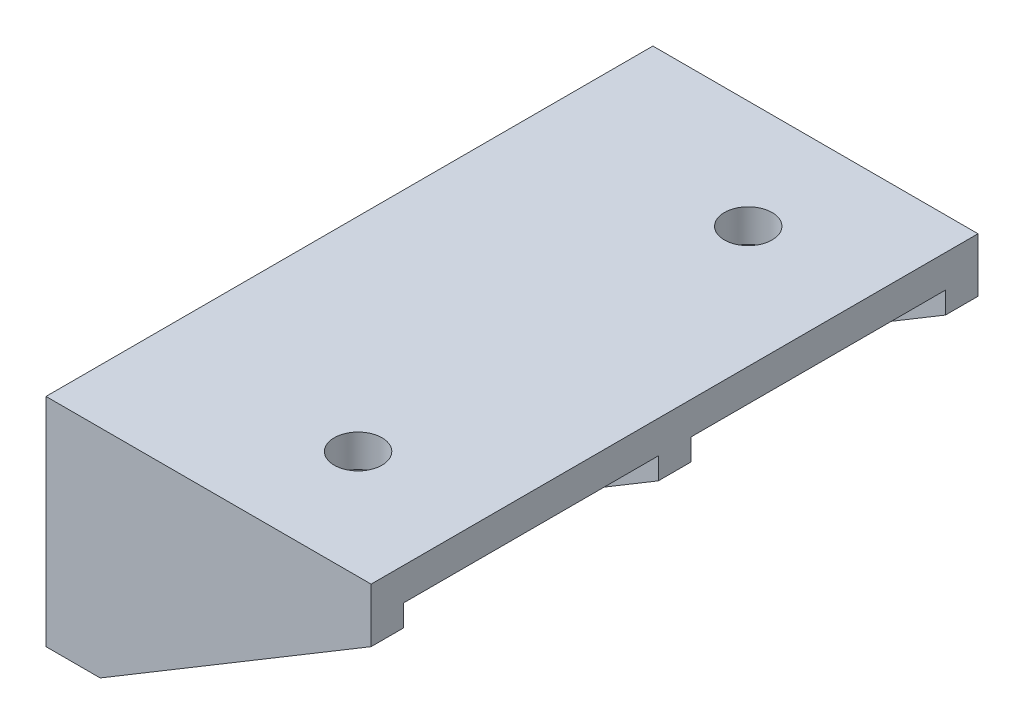
ISO-10303-21;
HEADER;
FILE_DESCRIPTION(('STEP AP214'),'2;1');
FILE_NAME('part.step','',(''),(''),'','','');
FILE_SCHEMA(('AUTOMOTIVE_DESIGN { 1 0 10303 214 1 1 1 1 }'));
ENDSEC;
DATA;
#1=APPLICATION_CONTEXT('core data for automotive mechanical design processes');
#2=APPLICATION_PROTOCOL_DEFINITION('international standard','automotive_design',2000,#1);
#3=PRODUCT_CONTEXT('',#1,'mechanical');
#4=PRODUCT('Part','Part','',(#3));
#5=PRODUCT_RELATED_PRODUCT_CATEGORY('part','',(#4));
#6=PRODUCT_DEFINITION_FORMATION('','',#4);
#7=PRODUCT_DEFINITION_CONTEXT('part definition',#1,'design');
#8=PRODUCT_DEFINITION('design','',#6,#7);
#9=PRODUCT_DEFINITION_SHAPE('','',#8);
#10=(LENGTH_UNIT() NAMED_UNIT(*) SI_UNIT(.MILLI.,.METRE.));
#11=(NAMED_UNIT(*) PLANE_ANGLE_UNIT() SI_UNIT($,.RADIAN.));
#12=(NAMED_UNIT(*) SI_UNIT($,.STERADIAN.) SOLID_ANGLE_UNIT());
#13=UNCERTAINTY_MEASURE_WITH_UNIT(LENGTH_MEASURE(1.E-05),#10,'distance_accuracy_value','');
#14=(GEOMETRIC_REPRESENTATION_CONTEXT(3) GLOBAL_UNCERTAINTY_ASSIGNED_CONTEXT((#13)) GLOBAL_UNIT_ASSIGNED_CONTEXT((#10,
#11,#12)) REPRESENTATION_CONTEXT('',''));
#15=CARTESIAN_POINT('',(0.,0.,0.));
#16=DIRECTION('',(0.,0.,1.));
#17=DIRECTION('',(1.,0.,0.));
#18=AXIS2_PLACEMENT_3D('',#15,#16,#17);
#19=CARTESIAN_POINT('',(3.,17.,28.));
#20=DIRECTION('',(-1.,0.,0.));
#21=DIRECTION('',(0.,-1.,0.));
#22=AXIS2_PLACEMENT_3D('',#19,#20,#21);
#23=PLANE('',#22);
#24=CARTESIAN_POINT('',(3.,10.,-18.));
#25=DIRECTION('',(-1.,0.,0.));
#26=DIRECTION('',(0.,-1.,0.));
#27=AXIS2_PLACEMENT_3D('',#24,#25,#26);
#28=CIRCLE('',#27,1.7);
#29=CARTESIAN_POINT('',(3.,10.,-16.3));
#30=VERTEX_POINT('',#29);
#31=EDGE_CURVE('E346',#30,#30,#28,.T.);
#32=ORIENTED_EDGE('',*,*,#31,.T.);
#33=EDGE_LOOP('',(#32));
#34=FACE_BOUND('',#33,.T.);
#35=DIRECTION('',(0.,1.,0.));
#36=VECTOR('',#35,1.);
#37=CARTESIAN_POINT('',(3.,0.,-25.));
#38=LINE('',#37,#36);
#39=CARTESIAN_POINT('',(3.,0.,-25.));
#40=VERTEX_POINT('',#39);
#41=CARTESIAN_POINT('',(3.,17.,-25.));
#42=VERTEX_POINT('',#41);
#43=EDGE_CURVE('E50',#40,#42,#38,.T.);
#44=ORIENTED_EDGE('',*,*,#43,.T.);
#45=DIRECTION('',(0.,0.,-1.));
#46=VECTOR('',#45,1.);
#47=CARTESIAN_POINT('',(3.,17.,28.));
#48=LINE('',#47,#46);
#49=CARTESIAN_POINT('',(3.,17.,-1.5));
#50=VERTEX_POINT('',#49);
#51=EDGE_CURVE('E256',#50,#42,#48,.T.);
#52=ORIENTED_EDGE('',*,*,#51,.F.);
#53=DIRECTION('',(0.,-1.,0.));
#54=VECTOR('',#53,1.);
#55=CARTESIAN_POINT('',(3.,17.,-1.5));
#56=LINE('',#55,#54);
#57=CARTESIAN_POINT('',(3.,0.,-1.5));
#58=VERTEX_POINT('',#57);
#59=EDGE_CURVE('E176',#50,#58,#56,.T.);
#60=ORIENTED_EDGE('',*,*,#59,.T.);
#61=DIRECTION('',(0.,0.,-1.));
#62=VECTOR('',#61,1.);
#63=CARTESIAN_POINT('',(3.,0.,28.));
#64=LINE('',#63,#62);
#65=EDGE_CURVE('E43',#58,#40,#64,.T.);
#66=ORIENTED_EDGE('',*,*,#65,.T.);
#67=EDGE_LOOP('',(#44,#52,#60,#66));
#68=FACE_BOUND('',#67,.T.);
#69=ADVANCED_FACE('F35',(#34,#68),#23,.F.);
#70=CARTESIAN_POINT('',(30.,17.,28.));
#71=DIRECTION('',(0.,1.,0.));
#72=DIRECTION('',(-1.,0.,0.));
#73=AXIS2_PLACEMENT_3D('',#70,#71,#72);
#74=PLANE('',#73);
#75=CARTESIAN_POINT('',(18.8,17.,-18.));
#76=DIRECTION('',(0.,1.,0.));
#77=DIRECTION('',(-1.,0.,0.));
#78=AXIS2_PLACEMENT_3D('',#75,#76,#77);
#79=CIRCLE('',#78,2.2);
#80=CARTESIAN_POINT('',(16.6,17.,-18.));
#81=VERTEX_POINT('',#80);
#82=EDGE_CURVE('E166',#81,#81,#79,.T.);
#83=ORIENTED_EDGE('',*,*,#82,.T.);
#84=EDGE_LOOP('',(#83));
#85=FACE_BOUND('',#84,.T.);
#86=DIRECTION('',(1.,0.,0.));
#87=VECTOR('',#86,1.);
#88=CARTESIAN_POINT('',(0.,17.,-25.));
#89=LINE('',#88,#87);
#90=CARTESIAN_POINT('',(30.,17.,-25.));
#91=VERTEX_POINT('',#90);
#92=EDGE_CURVE('E173',#42,#91,#89,.T.);
#93=ORIENTED_EDGE('',*,*,#92,.T.);
#94=DIRECTION('',(0.,0.,-1.));
#95=VECTOR('',#94,1.);
#96=CARTESIAN_POINT('',(30.,17.,28.));
#97=LINE('',#96,#95);
#98=CARTESIAN_POINT('',(30.,17.,-1.5));
#99=VERTEX_POINT('',#98);
#100=EDGE_CURVE('E253',#99,#91,#97,.T.);
#101=ORIENTED_EDGE('',*,*,#100,.F.);
#102=DIRECTION('',(-1.,0.,0.));
#103=VECTOR('',#102,1.);
#104=CARTESIAN_POINT('',(30.,17.,-1.5));
#105=LINE('',#104,#103);
#106=EDGE_CURVE('E182',#99,#50,#105,.T.);
#107=ORIENTED_EDGE('',*,*,#106,.T.);
#108=ORIENTED_EDGE('',*,*,#51,.T.);
#109=EDGE_LOOP('',(#93,#101,#107,#108));
#110=FACE_BOUND('',#109,.T.);
#111=ADVANCED_FACE('F263',(#85,#110),#74,.F.);
#112=CARTESIAN_POINT('',(3.,10.,18.));
#113=DIRECTION('',(-1.,0.,0.));
#114=DIRECTION('',(0.,-1.,0.));
#115=AXIS2_PLACEMENT_3D('',#112,#113,#114);
#116=CIRCLE('',#115,1.7);
#117=CARTESIAN_POINT('',(3.,10.,19.7));
#118=VERTEX_POINT('',#117);
#119=EDGE_CURVE('E337',#118,#118,#116,.T.);
#120=ORIENTED_EDGE('',*,*,#119,.T.);
#121=EDGE_LOOP('',(#120));
#122=FACE_BOUND('',#121,.T.);
#123=CARTESIAN_POINT('',(3.,0.,25.));
#124=VERTEX_POINT('',#123);
#125=CARTESIAN_POINT('',(3.,0.,1.5));
#126=VERTEX_POINT('',#125);
#127=EDGE_CURVE('E11',#124,#126,#64,.T.);
#128=ORIENTED_EDGE('',*,*,#127,.T.);
#129=DIRECTION('',(0.,-1.,0.));
#130=VECTOR('',#129,1.);
#131=CARTESIAN_POINT('',(3.,17.,1.5));
#132=LINE('',#131,#130);
#133=CARTESIAN_POINT('',(3.,17.,1.5));
#134=VERTEX_POINT('',#133);
#135=EDGE_CURVE('E178',#134,#126,#132,.T.);
#136=ORIENTED_EDGE('',*,*,#135,.F.);
#137=CARTESIAN_POINT('',(3.,17.,25.));
#138=VERTEX_POINT('',#137);
#139=EDGE_CURVE('E257',#138,#134,#48,.T.);
#140=ORIENTED_EDGE('',*,*,#139,.F.);
#141=DIRECTION('',(0.,-1.,0.));
#142=VECTOR('',#141,1.);
#143=CARTESIAN_POINT('',(3.,0.,25.));
#144=LINE('',#143,#142);
#145=EDGE_CURVE('E210',#138,#124,#144,.T.);
#146=ORIENTED_EDGE('',*,*,#145,.T.);
#147=EDGE_LOOP('',(#128,#136,#140,#146));
#148=FACE_BOUND('',#147,.T.);
#149=ADVANCED_FACE('F283',(#122,#148),#23,.F.);
#150=CARTESIAN_POINT('',(18.8,17.,18.));
#151=DIRECTION('',(0.,1.,0.));
#152=DIRECTION('',(-1.,0.,0.));
#153=AXIS2_PLACEMENT_3D('',#150,#151,#152);
#154=CIRCLE('',#153,2.2);
#155=CARTESIAN_POINT('',(16.6,17.,18.));
#156=VERTEX_POINT('',#155);
#157=EDGE_CURVE('E169',#156,#156,#154,.T.);
#158=ORIENTED_EDGE('',*,*,#157,.T.);
#159=EDGE_LOOP('',(#158));
#160=FACE_BOUND('',#159,.T.);
#161=ORIENTED_EDGE('',*,*,#139,.T.);
#162=DIRECTION('',(-1.,0.,0.));
#163=VECTOR('',#162,1.);
#164=CARTESIAN_POINT('',(30.,17.,1.5));
#165=LINE('',#164,#163);
#166=CARTESIAN_POINT('',(30.,17.,1.5));
#167=VERTEX_POINT('',#166);
#168=EDGE_CURVE('E188',#167,#134,#165,.T.);
#169=ORIENTED_EDGE('',*,*,#168,.F.);
#170=CARTESIAN_POINT('',(30.,17.,25.));
#171=VERTEX_POINT('',#170);
#172=EDGE_CURVE('E254',#171,#167,#97,.T.);
#173=ORIENTED_EDGE('',*,*,#172,.F.);
#174=DIRECTION('',(-1.,0.,0.));
#175=VECTOR('',#174,1.);
#176=CARTESIAN_POINT('',(0.,17.,25.));
#177=LINE('',#176,#175);
#178=EDGE_CURVE('E207',#171,#138,#177,.T.);
#179=ORIENTED_EDGE('',*,*,#178,.T.);
#180=EDGE_LOOP('',(#161,#169,#173,#179));
#181=FACE_BOUND('',#180,.T.);
#182=ADVANCED_FACE('F289',(#160,#181),#74,.F.);
#183=CARTESIAN_POINT('',(0.,0.,28.));
#184=DIRECTION('',(0.,1.,0.));
#185=DIRECTION('',(0.,0.,1.));
#186=AXIS2_PLACEMENT_3D('',#183,#184,#185);
#187=PLANE('',#186);
#188=DIRECTION('',(1.,0.,0.));
#189=VECTOR('',#188,1.);
#190=CARTESIAN_POINT('',(0.,0.,-28.));
#191=LINE('',#190,#189);
#192=CARTESIAN_POINT('',(0.,0.,-28.));
#193=VERTEX_POINT('',#192);
#194=CARTESIAN_POINT('',(5.,0.,-28.));
#195=VERTEX_POINT('',#194);
#196=EDGE_CURVE('E146',#193,#195,#191,.T.);
#197=ORIENTED_EDGE('',*,*,#196,.T.);
#198=DIRECTION('',(0.,0.,-1.));
#199=VECTOR('',#198,1.);
#200=CARTESIAN_POINT('',(5.,0.,-25.));
#201=LINE('',#200,#199);
#202=CARTESIAN_POINT('',(5.,0.,-25.));
#203=VERTEX_POINT('',#202);
#204=EDGE_CURVE('E141',#203,#195,#201,.T.);
#205=ORIENTED_EDGE('',*,*,#204,.F.);
#206=DIRECTION('',(-1.,0.,0.));
#207=VECTOR('',#206,1.);
#208=CARTESIAN_POINT('',(0.,0.,-25.));
#209=LINE('',#208,#207);
#210=EDGE_CURVE('E143',#203,#40,#209,.T.);
#211=ORIENTED_EDGE('',*,*,#210,.T.);
#212=ORIENTED_EDGE('',*,*,#65,.F.);
#213=DIRECTION('',(1.,0.,0.));
#214=VECTOR('',#213,1.);
#215=CARTESIAN_POINT('',(3.,0.,-1.5));
#216=LINE('',#215,#214);
#217=CARTESIAN_POINT('',(5.,0.,-1.5));
#218=VERTEX_POINT('',#217);
#219=EDGE_CURVE('E192',#58,#218,#216,.T.);
#220=ORIENTED_EDGE('',*,*,#219,.T.);
#221=DIRECTION('',(0.,0.,-1.));
#222=VECTOR('',#221,1.);
#223=CARTESIAN_POINT('',(5.,0.,1.5));
#224=LINE('',#223,#222);
#225=CARTESIAN_POINT('',(5.,0.,1.5));
#226=VERTEX_POINT('',#225);
#227=EDGE_CURVE('E203',#226,#218,#224,.T.);
#228=ORIENTED_EDGE('',*,*,#227,.F.);
#229=DIRECTION('',(1.,0.,0.));
#230=VECTOR('',#229,1.);
#231=CARTESIAN_POINT('',(3.,0.,1.5));
#232=LINE('',#231,#230);
#233=EDGE_CURVE('E181',#126,#226,#232,.T.);
#234=ORIENTED_EDGE('',*,*,#233,.F.);
#235=ORIENTED_EDGE('',*,*,#127,.F.);
#236=DIRECTION('',(1.,0.,0.));
#237=VECTOR('',#236,1.);
#238=CARTESIAN_POINT('',(0.,0.,25.));
#239=LINE('',#238,#237);
#240=CARTESIAN_POINT('',(5.,0.,25.));
#241=VERTEX_POINT('',#240);
#242=EDGE_CURVE('E213',#124,#241,#239,.T.);
#243=ORIENTED_EDGE('',*,*,#242,.T.);
#244=DIRECTION('',(0.,0.,1.));
#245=VECTOR('',#244,1.);
#246=CARTESIAN_POINT('',(5.,0.,25.));
#247=LINE('',#246,#245);
#248=CARTESIAN_POINT('',(5.,0.,28.));
#249=VERTEX_POINT('',#248);
#250=EDGE_CURVE('E222',#241,#249,#247,.T.);
#251=ORIENTED_EDGE('',*,*,#250,.T.);
#252=DIRECTION('',(1.,0.,0.));
#253=VECTOR('',#252,1.);
#254=CARTESIAN_POINT('',(0.,0.,28.));
#255=LINE('',#254,#253);
#256=CARTESIAN_POINT('',(0.,0.,28.));
#257=VERTEX_POINT('',#256);
#258=EDGE_CURVE('E230',#257,#249,#255,.T.);
#259=ORIENTED_EDGE('',*,*,#258,.F.);
#260=DIRECTION('',(0.,0.,-1.));
#261=VECTOR('',#260,1.);
#262=CARTESIAN_POINT('',(0.,0.,28.));
#263=LINE('',#262,#261);
#264=EDGE_CURVE('E239',#257,#193,#263,.T.);
#265=ORIENTED_EDGE('',*,*,#264,.T.);
#266=EDGE_LOOP('',(#197,#205,#211,#212,#220,#228,#234,#235,#243,#251,#259,#265));
#267=FACE_BOUND('',#266,.T.);
#268=ADVANCED_FACE('F37',(#267),#187,.F.);
#269=CARTESIAN_POINT('',(30.,17.,28.));
#270=DIRECTION('',(-1.,0.,0.));
#271=DIRECTION('',(0.,0.,1.));
#272=AXIS2_PLACEMENT_3D('',#269,#270,#271);
#273=PLANE('',#272);
#274=DIRECTION('',(0.,1.,0.));
#275=VECTOR('',#274,1.);
#276=CARTESIAN_POINT('',(30.,17.,-28.));
#277=LINE('',#276,#275);
#278=CARTESIAN_POINT('',(30.,15.,-28.));
#279=VERTEX_POINT('',#278);
#280=CARTESIAN_POINT('',(30.,20.,-28.));
#281=VERTEX_POINT('',#280);
#282=EDGE_CURVE('E241',#279,#281,#277,.T.);
#283=ORIENTED_EDGE('',*,*,#282,.T.);
#284=DIRECTION('',(0.,0.,-1.));
#285=VECTOR('',#284,1.);
#286=CARTESIAN_POINT('',(30.,20.,28.));
#287=LINE('',#286,#285);
#288=CARTESIAN_POINT('',(30.,20.,28.));
#289=VERTEX_POINT('',#288);
#290=EDGE_CURVE('E250',#289,#281,#287,.T.);
#291=ORIENTED_EDGE('',*,*,#290,.F.);
#292=DIRECTION('',(0.,1.,0.));
#293=VECTOR('',#292,1.);
#294=CARTESIAN_POINT('',(30.,17.,28.));
#295=LINE('',#294,#293);
#296=CARTESIAN_POINT('',(30.,15.,28.));
#297=VERTEX_POINT('',#296);
#298=EDGE_CURVE('E232',#297,#289,#295,.T.);
#299=ORIENTED_EDGE('',*,*,#298,.F.);
#300=DIRECTION('',(0.,0.,1.));
#301=VECTOR('',#300,1.);
#302=CARTESIAN_POINT('',(30.,15.,25.));
#303=LINE('',#302,#301);
#304=CARTESIAN_POINT('',(30.,15.,25.));
#305=VERTEX_POINT('',#304);
#306=EDGE_CURVE('E225',#305,#297,#303,.T.);
#307=ORIENTED_EDGE('',*,*,#306,.F.);
#308=DIRECTION('',(0.,1.,0.));
#309=VECTOR('',#308,1.);
#310=CARTESIAN_POINT('',(30.,0.,25.));
#311=LINE('',#310,#309);
#312=EDGE_CURVE('E219',#305,#171,#311,.T.);
#313=ORIENTED_EDGE('',*,*,#312,.T.);
#314=ORIENTED_EDGE('',*,*,#172,.T.);
#315=DIRECTION('',(0.,1.,0.));
#316=VECTOR('',#315,1.);
#317=CARTESIAN_POINT('',(30.,15.,1.5));
#318=LINE('',#317,#316);
#319=CARTESIAN_POINT('',(30.,15.,1.5));
#320=VERTEX_POINT('',#319);
#321=EDGE_CURVE('E186',#320,#167,#318,.T.);
#322=ORIENTED_EDGE('',*,*,#321,.F.);
#323=DIRECTION('',(0.,0.,-1.));
#324=VECTOR('',#323,1.);
#325=CARTESIAN_POINT('',(30.,15.,1.5));
#326=LINE('',#325,#324);
#327=CARTESIAN_POINT('',(30.,15.,-1.5));
#328=VERTEX_POINT('',#327);
#329=EDGE_CURVE('E190',#320,#328,#326,.T.);
#330=ORIENTED_EDGE('',*,*,#329,.T.);
#331=DIRECTION('',(0.,1.,0.));
#332=VECTOR('',#331,1.);
#333=CARTESIAN_POINT('',(30.,15.,-1.5));
#334=LINE('',#333,#332);
#335=EDGE_CURVE('E196',#328,#99,#334,.T.);
#336=ORIENTED_EDGE('',*,*,#335,.T.);
#337=ORIENTED_EDGE('',*,*,#100,.T.);
#338=DIRECTION('',(0.,-1.,0.));
#339=VECTOR('',#338,1.);
#340=CARTESIAN_POINT('',(30.,0.,-25.));
#341=LINE('',#340,#339);
#342=CARTESIAN_POINT('',(30.,15.,-25.));
#343=VERTEX_POINT('',#342);
#344=EDGE_CURVE('E152',#91,#343,#341,.T.);
#345=ORIENTED_EDGE('',*,*,#344,.T.);
#346=DIRECTION('',(0.,0.,-1.));
#347=VECTOR('',#346,1.);
#348=CARTESIAN_POINT('',(30.,15.,-25.));
#349=LINE('',#348,#347);
#350=EDGE_CURVE('E151',#343,#279,#349,.T.);
#351=ORIENTED_EDGE('',*,*,#350,.T.);
#352=EDGE_LOOP('',(#283,#291,#299,#307,#313,#314,#322,#330,#336,#337,#345,#351));
#353=FACE_BOUND('',#352,.T.);
#354=ADVANCED_FACE('F267',(#353),#273,.F.);
#355=CARTESIAN_POINT('',(0.,20.,28.));
#356=DIRECTION('',(0.,-1.,0.));
#357=DIRECTION('',(0.,0.,-1.));
#358=AXIS2_PLACEMENT_3D('',#355,#356,#357);
#359=PLANE('',#358);
#360=CARTESIAN_POINT('',(18.8,20.,-18.));
#361=DIRECTION('',(0.,-1.,0.));
#362=DIRECTION('',(0.,0.,-1.));
#363=AXIS2_PLACEMENT_3D('',#360,#361,#362);
#364=CIRCLE('',#363,2.2);
#365=CARTESIAN_POINT('',(18.8,20.,-20.2));
#366=VERTEX_POINT('',#365);
#367=EDGE_CURVE('E350',#366,#366,#364,.T.);
#368=ORIENTED_EDGE('',*,*,#367,.T.);
#369=EDGE_LOOP('',(#368));
#370=FACE_BOUND('',#369,.T.);
#371=CARTESIAN_POINT('',(18.8,20.,18.));
#372=DIRECTION('',(0.,-1.,0.));
#373=DIRECTION('',(0.,0.,-1.));
#374=AXIS2_PLACEMENT_3D('',#371,#372,#373);
#375=CIRCLE('',#374,2.2);
#376=CARTESIAN_POINT('',(18.8,20.,15.8));
#377=VERTEX_POINT('',#376);
#378=EDGE_CURVE('E343',#377,#377,#375,.T.);
#379=ORIENTED_EDGE('',*,*,#378,.T.);
#380=EDGE_LOOP('',(#379));
#381=FACE_BOUND('',#380,.T.);
#382=DIRECTION('',(-1.,0.,0.));
#383=VECTOR('',#382,1.);
#384=CARTESIAN_POINT('',(0.,20.,-28.));
#385=LINE('',#384,#383);
#386=CARTESIAN_POINT('',(0.,20.,-28.));
#387=VERTEX_POINT('',#386);
#388=EDGE_CURVE('E243',#281,#387,#385,.T.);
#389=ORIENTED_EDGE('',*,*,#388,.T.);
#390=DIRECTION('',(0.,0.,-1.));
#391=VECTOR('',#390,1.);
#392=CARTESIAN_POINT('',(0.,20.,28.));
#393=LINE('',#392,#391);
#394=CARTESIAN_POINT('',(0.,20.,28.));
#395=VERTEX_POINT('',#394);
#396=EDGE_CURVE('E247',#395,#387,#393,.T.);
#397=ORIENTED_EDGE('',*,*,#396,.F.);
#398=DIRECTION('',(-1.,0.,0.));
#399=VECTOR('',#398,1.);
#400=CARTESIAN_POINT('',(0.,20.,28.));
#401=LINE('',#400,#399);
#402=EDGE_CURVE('E235',#289,#395,#401,.T.);
#403=ORIENTED_EDGE('',*,*,#402,.F.);
#404=ORIENTED_EDGE('',*,*,#290,.T.);
#405=EDGE_LOOP('',(#389,#397,#403,#404));
#406=FACE_BOUND('',#405,.T.);
#407=ADVANCED_FACE('F308',(#370,#381,#406),#359,.F.);
#408=CARTESIAN_POINT('',(0.,0.,28.));
#409=DIRECTION('',(1.,0.,0.));
#410=DIRECTION('',(0.,0.,-1.));
#411=AXIS2_PLACEMENT_3D('',#408,#409,#410);
#412=PLANE('',#411);
#413=CARTESIAN_POINT('',(0.,10.,18.));
#414=DIRECTION('',(1.,0.,0.));
#415=DIRECTION('',(0.,0.,-1.));
#416=AXIS2_PLACEMENT_3D('',#413,#414,#415);
#417=CIRCLE('',#416,1.7);
#418=CARTESIAN_POINT('',(0.,10.,19.7));
#419=VERTEX_POINT('',#418);
#420=EDGE_CURVE('E339',#419,#419,#417,.T.);
#421=ORIENTED_EDGE('',*,*,#420,.T.);
#422=EDGE_LOOP('',(#421));
#423=FACE_BOUND('',#422,.T.);
#424=CARTESIAN_POINT('',(0.,10.,-18.));
#425=DIRECTION('',(1.,0.,0.));
#426=DIRECTION('',(0.,0.,-1.));
#427=AXIS2_PLACEMENT_3D('',#424,#425,#426);
#428=CIRCLE('',#427,1.7);
#429=CARTESIAN_POINT('',(0.,10.,-16.3));
#430=VERTEX_POINT('',#429);
#431=EDGE_CURVE('E340',#430,#430,#428,.T.);
#432=ORIENTED_EDGE('',*,*,#431,.T.);
#433=EDGE_LOOP('',(#432));
#434=FACE_BOUND('',#433,.T.);
#435=DIRECTION('',(0.,-1.,0.));
#436=VECTOR('',#435,1.);
#437=CARTESIAN_POINT('',(0.,0.,-28.));
#438=LINE('',#437,#436);
#439=EDGE_CURVE('E233',#387,#193,#438,.T.);
#440=ORIENTED_EDGE('',*,*,#439,.T.);
#441=ORIENTED_EDGE('',*,*,#264,.F.);
#442=DIRECTION('',(0.,-1.,0.));
#443=VECTOR('',#442,1.);
#444=CARTESIAN_POINT('',(0.,0.,28.));
#445=LINE('',#444,#443);
#446=EDGE_CURVE('E237',#395,#257,#445,.T.);
#447=ORIENTED_EDGE('',*,*,#446,.F.);
#448=ORIENTED_EDGE('',*,*,#396,.T.);
#449=EDGE_LOOP('',(#440,#441,#447,#448));
#450=FACE_BOUND('',#449,.T.);
#451=ADVANCED_FACE('F301',(#423,#434,#450),#412,.F.);
#452=CARTESIAN_POINT('',(0.,0.,28.));
#453=DIRECTION('',(0.,0.,-1.));
#454=DIRECTION('',(-1.,0.,0.));
#455=AXIS2_PLACEMENT_3D('',#452,#453,#454);
#456=PLANE('',#455);
#457=DIRECTION('',(0.857492925712544,0.514495755427526,0.));
#458=VECTOR('',#457,1.);
#459=CARTESIAN_POINT('',(1.32352941176471,-2.20588235294118,28.));
#460=LINE('',#459,#458);
#461=EDGE_CURVE('E206',#249,#297,#460,.T.);
#462=ORIENTED_EDGE('',*,*,#461,.T.);
#463=ORIENTED_EDGE('',*,*,#298,.T.);
#464=ORIENTED_EDGE('',*,*,#402,.T.);
#465=ORIENTED_EDGE('',*,*,#446,.T.);
#466=ORIENTED_EDGE('',*,*,#258,.T.);
#467=EDGE_LOOP('',(#462,#463,#464,#465,#466));
#468=FACE_BOUND('',#467,.T.);
#469=ADVANCED_FACE('F296',(#468),#456,.F.);
#470=CARTESIAN_POINT('',(0.,0.,-28.));
#471=DIRECTION('',(0.,0.,-1.));
#472=DIRECTION('',(-1.,0.,0.));
#473=AXIS2_PLACEMENT_3D('',#470,#471,#472);
#474=PLANE('',#473);
#475=ORIENTED_EDGE('',*,*,#282,.F.);
#476=DIRECTION('',(-0.857492925712544,-0.514495755427526,0.));
#477=VECTOR('',#476,1.);
#478=CARTESIAN_POINT('',(1.32352941176471,-2.20588235294118,-28.));
#479=LINE('',#478,#477);
#480=EDGE_CURVE('E164',#279,#195,#479,.T.);
#481=ORIENTED_EDGE('',*,*,#480,.T.);
#482=ORIENTED_EDGE('',*,*,#196,.F.);
#483=ORIENTED_EDGE('',*,*,#439,.F.);
#484=ORIENTED_EDGE('',*,*,#388,.F.);
#485=EDGE_LOOP('',(#475,#481,#482,#483,#484));
#486=FACE_BOUND('',#485,.T.);
#487=ADVANCED_FACE('F305',(#486),#474,.T.);
#488=CARTESIAN_POINT('',(1.32352941176471,-2.20588235294118,25.));
#489=DIRECTION('',(0.514495755427527,-0.857492925712544,0.));
#490=DIRECTION('',(0.857492925712544,0.514495755427527,0.));
#491=AXIS2_PLACEMENT_3D('',#488,#489,#490);
#492=PLANE('',#491);
#493=ORIENTED_EDGE('',*,*,#461,.F.);
#494=ORIENTED_EDGE('',*,*,#250,.F.);
#495=DIRECTION('',(0.857492925712544,0.514495755427526,0.));
#496=VECTOR('',#495,1.);
#497=CARTESIAN_POINT('',(1.32352941176471,-2.20588235294118,25.));
#498=LINE('',#497,#496);
#499=EDGE_CURVE('E216',#241,#305,#498,.T.);
#500=ORIENTED_EDGE('',*,*,#499,.T.);
#501=ORIENTED_EDGE('',*,*,#306,.T.);
#502=EDGE_LOOP('',(#493,#494,#500,#501));
#503=FACE_BOUND('',#502,.T.);
#504=ADVANCED_FACE('F292',(#503),#492,.T.);
#505=CARTESIAN_POINT('',(0.,0.,25.));
#506=DIRECTION('',(0.,0.,1.));
#507=DIRECTION('',(1.,0.,0.));
#508=AXIS2_PLACEMENT_3D('',#505,#506,#507);
#509=PLANE('',#508);
#510=ORIENTED_EDGE('',*,*,#178,.F.);
#511=ORIENTED_EDGE('',*,*,#312,.F.);
#512=ORIENTED_EDGE('',*,*,#499,.F.);
#513=ORIENTED_EDGE('',*,*,#242,.F.);
#514=ORIENTED_EDGE('',*,*,#145,.F.);
#515=EDGE_LOOP('',(#510,#511,#512,#513,#514));
#516=FACE_BOUND('',#515,.T.);
#517=ADVANCED_FACE('F285',(#516),#509,.F.);
#518=CARTESIAN_POINT('',(5.,0.,1.5));
#519=DIRECTION('',(-0.514495755427527,0.857492925712544,0.));
#520=DIRECTION('',(-0.857492925712544,-0.514495755427527,0.));
#521=AXIS2_PLACEMENT_3D('',#518,#519,#520);
#522=PLANE('',#521);
#523=DIRECTION('',(0.857492925712544,0.514495755427526,0.));
#524=VECTOR('',#523,1.);
#525=CARTESIAN_POINT('',(5.,0.,-1.5));
#526=LINE('',#525,#524);
#527=EDGE_CURVE('E194',#218,#328,#526,.T.);
#528=ORIENTED_EDGE('',*,*,#527,.T.);
#529=ORIENTED_EDGE('',*,*,#329,.F.);
#530=DIRECTION('',(0.857492925712544,0.514495755427526,0.));
#531=VECTOR('',#530,1.);
#532=CARTESIAN_POINT('',(5.,0.,1.5));
#533=LINE('',#532,#531);
#534=EDGE_CURVE('E184',#226,#320,#533,.T.);
#535=ORIENTED_EDGE('',*,*,#534,.F.);
#536=ORIENTED_EDGE('',*,*,#227,.T.);
#537=EDGE_LOOP('',(#528,#529,#535,#536));
#538=FACE_BOUND('',#537,.T.);
#539=ADVANCED_FACE('F277',(#538),#522,.F.);
#540=CARTESIAN_POINT('',(0.,0.,1.5));
#541=DIRECTION('',(0.,0.,1.));
#542=DIRECTION('',(1.,0.,0.));
#543=AXIS2_PLACEMENT_3D('',#540,#541,#542);
#544=PLANE('',#543);
#545=ORIENTED_EDGE('',*,*,#135,.T.);
#546=ORIENTED_EDGE('',*,*,#233,.T.);
#547=ORIENTED_EDGE('',*,*,#534,.T.);
#548=ORIENTED_EDGE('',*,*,#321,.T.);
#549=ORIENTED_EDGE('',*,*,#168,.T.);
#550=EDGE_LOOP('',(#545,#546,#547,#548,#549));
#551=FACE_BOUND('',#550,.T.);
#552=ADVANCED_FACE('F279',(#551),#544,.T.);
#553=CARTESIAN_POINT('',(0.,0.,-1.5));
#554=DIRECTION('',(0.,0.,1.));
#555=DIRECTION('',(1.,0.,0.));
#556=AXIS2_PLACEMENT_3D('',#553,#554,#555);
#557=PLANE('',#556);
#558=ORIENTED_EDGE('',*,*,#59,.F.);
#559=ORIENTED_EDGE('',*,*,#106,.F.);
#560=ORIENTED_EDGE('',*,*,#335,.F.);
#561=ORIENTED_EDGE('',*,*,#527,.F.);
#562=ORIENTED_EDGE('',*,*,#219,.F.);
#563=EDGE_LOOP('',(#558,#559,#560,#561,#562));
#564=FACE_BOUND('',#563,.T.);
#565=ADVANCED_FACE('F273',(#564),#557,.F.);
#566=CARTESIAN_POINT('',(1.32352941176471,-2.20588235294118,-25.));
#567=DIRECTION('',(0.514495755427527,-0.857492925712544,0.));
#568=DIRECTION('',(0.857492925712544,0.514495755427527,0.));
#569=AXIS2_PLACEMENT_3D('',#566,#567,#568);
#570=PLANE('',#569);
#571=ORIENTED_EDGE('',*,*,#480,.F.);
#572=ORIENTED_EDGE('',*,*,#350,.F.);
#573=DIRECTION('',(-0.857492925712544,-0.514495755427526,0.));
#574=VECTOR('',#573,1.);
#575=CARTESIAN_POINT('',(1.32352941176471,-2.20588235294118,-25.));
#576=LINE('',#575,#574);
#577=EDGE_CURVE('E158',#343,#203,#576,.T.);
#578=ORIENTED_EDGE('',*,*,#577,.T.);
#579=ORIENTED_EDGE('',*,*,#204,.T.);
#580=EDGE_LOOP('',(#571,#572,#578,#579));
#581=FACE_BOUND('',#580,.T.);
#582=ADVANCED_FACE('F162',(#581),#570,.T.);
#583=CARTESIAN_POINT('',(0.,0.,-25.));
#584=DIRECTION('',(0.,0.,-1.));
#585=DIRECTION('',(-1.,0.,0.));
#586=AXIS2_PLACEMENT_3D('',#583,#584,#585);
#587=PLANE('',#586);
#588=ORIENTED_EDGE('',*,*,#577,.F.);
#589=ORIENTED_EDGE('',*,*,#344,.F.);
#590=ORIENTED_EDGE('',*,*,#92,.F.);
#591=ORIENTED_EDGE('',*,*,#43,.F.);
#592=ORIENTED_EDGE('',*,*,#210,.F.);
#593=EDGE_LOOP('',(#588,#589,#590,#591,#592));
#594=FACE_BOUND('',#593,.T.);
#595=ADVANCED_FACE('F156',(#594),#587,.F.);
#596=CARTESIAN_POINT('',(18.8,20.001,18.));
#597=DIRECTION('',(0.,-1.,0.));
#598=DIRECTION('',(0.,0.,-1.));
#599=AXIS2_PLACEMENT_3D('',#596,#597,#598);
#600=CYLINDRICAL_SURFACE('',#599,2.2);
#601=ORIENTED_EDGE('',*,*,#378,.F.);
#602=EDGE_LOOP('',(#601));
#603=FACE_BOUND('',#602,.T.);
#604=ORIENTED_EDGE('',*,*,#157,.F.);
#605=EDGE_LOOP('',(#604));
#606=FACE_BOUND('',#605,.T.);
#607=ADVANCED_FACE('F358',(#603,#606),#600,.F.);
#608=CARTESIAN_POINT('',(18.8,20.001,-18.));
#609=DIRECTION('',(0.,-1.,0.));
#610=DIRECTION('',(0.,0.,-1.));
#611=AXIS2_PLACEMENT_3D('',#608,#609,#610);
#612=CYLINDRICAL_SURFACE('',#611,2.2);
#613=ORIENTED_EDGE('',*,*,#367,.F.);
#614=EDGE_LOOP('',(#613));
#615=FACE_BOUND('',#614,.T.);
#616=ORIENTED_EDGE('',*,*,#82,.F.);
#617=EDGE_LOOP('',(#616));
#618=FACE_BOUND('',#617,.T.);
#619=ADVANCED_FACE('F360',(#615,#618),#612,.F.);
#620=CARTESIAN_POINT('',(30.001,10.,-18.));
#621=DIRECTION('',(-1.,0.,0.));
#622=DIRECTION('',(0.,0.,1.));
#623=AXIS2_PLACEMENT_3D('',#620,#621,#622);
#624=CYLINDRICAL_SURFACE('',#623,1.7);
#625=CARTESIAN_POINT('',(0.,10.,-16.3));
#626=CARTESIAN_POINT('',(0.03125,10.,-16.3));
#627=CARTESIAN_POINT('',(0.0625000000000001,10.,-16.3));
#628=CARTESIAN_POINT('',(0.125,10.,-16.3));
#629=CARTESIAN_POINT('',(0.15625,10.,-16.3));
#630=CARTESIAN_POINT('',(0.21875,10.,-16.3));
#631=CARTESIAN_POINT('',(0.25,10.,-16.3));
#632=CARTESIAN_POINT('',(0.3125,10.,-16.3));
#633=CARTESIAN_POINT('',(0.34375,10.,-16.3));
#634=CARTESIAN_POINT('',(0.40625,10.,-16.3));
#635=CARTESIAN_POINT('',(0.4375,10.,-16.3));
#636=CARTESIAN_POINT('',(0.5,10.,-16.3));
#637=CARTESIAN_POINT('',(0.53125,10.,-16.3));
#638=CARTESIAN_POINT('',(0.593750000000001,10.,-16.3));
#639=CARTESIAN_POINT('',(0.625000000000001,10.,-16.3));
#640=CARTESIAN_POINT('',(0.687500000000001,10.,-16.3));
#641=CARTESIAN_POINT('',(0.718750000000001,10.,-16.3));
#642=CARTESIAN_POINT('',(0.781250000000001,10.,-16.3));
#643=CARTESIAN_POINT('',(0.812500000000001,10.,-16.3));
#644=CARTESIAN_POINT('',(0.875000000000001,10.,-16.3));
#645=CARTESIAN_POINT('',(0.906250000000001,10.,-16.3));
#646=CARTESIAN_POINT('',(0.968750000000001,10.,-16.3));
#647=CARTESIAN_POINT('',(1.,10.,-16.3));
#648=CARTESIAN_POINT('',(1.0625,10.,-16.3));
#649=CARTESIAN_POINT('',(1.09375,10.,-16.3));
#650=CARTESIAN_POINT('',(1.15625,10.,-16.3));
#651=CARTESIAN_POINT('',(1.1875,10.,-16.3));
#652=CARTESIAN_POINT('',(1.25,10.,-16.3));
#653=CARTESIAN_POINT('',(1.28125,10.,-16.3));
#654=CARTESIAN_POINT('',(1.34375,10.,-16.3));
#655=CARTESIAN_POINT('',(1.375,10.,-16.3));
#656=CARTESIAN_POINT('',(1.4375,10.,-16.3));
#657=CARTESIAN_POINT('',(1.46875,10.,-16.3));
#658=CARTESIAN_POINT('',(1.53125,10.,-16.3));
#659=CARTESIAN_POINT('',(1.5625,10.,-16.3));
#660=CARTESIAN_POINT('',(1.625,10.,-16.3));
#661=CARTESIAN_POINT('',(1.65625,10.,-16.3));
#662=CARTESIAN_POINT('',(1.71875,10.,-16.3));
#663=CARTESIAN_POINT('',(1.75,10.,-16.3));
#664=CARTESIAN_POINT('',(1.8125,10.,-16.3));
#665=CARTESIAN_POINT('',(1.84375,10.,-16.3));
#666=CARTESIAN_POINT('',(1.90625,10.,-16.3));
#667=CARTESIAN_POINT('',(1.9375,10.,-16.3));
#668=CARTESIAN_POINT('',(2.,10.,-16.3));
#669=CARTESIAN_POINT('',(2.03125,10.,-16.3));
#670=CARTESIAN_POINT('',(2.09375,10.,-16.3));
#671=CARTESIAN_POINT('',(2.125,10.,-16.3));
#672=CARTESIAN_POINT('',(2.1875,10.,-16.3));
#673=CARTESIAN_POINT('',(2.21875,10.,-16.3));
#674=CARTESIAN_POINT('',(2.28125,10.,-16.3));
#675=CARTESIAN_POINT('',(2.3125,10.,-16.3));
#676=CARTESIAN_POINT('',(2.375,10.,-16.3));
#677=CARTESIAN_POINT('',(2.40625,10.,-16.3));
#678=CARTESIAN_POINT('',(2.46875,10.,-16.3));
#679=CARTESIAN_POINT('',(2.5,10.,-16.3));
#680=CARTESIAN_POINT('',(2.5625,10.,-16.3));
#681=CARTESIAN_POINT('',(2.59375,10.,-16.3));
#682=CARTESIAN_POINT('',(2.65625,10.,-16.3));
#683=CARTESIAN_POINT('',(2.6875,10.,-16.3));
#684=CARTESIAN_POINT('',(2.75,10.,-16.3));
#685=CARTESIAN_POINT('',(2.78125,10.,-16.3));
#686=CARTESIAN_POINT('',(2.84375,10.,-16.3));
#687=CARTESIAN_POINT('',(2.875,10.,-16.3));
#688=CARTESIAN_POINT('',(2.9375,10.,-16.3));
#689=CARTESIAN_POINT('',(2.96875,10.,-16.3));
#690=CARTESIAN_POINT('',(3.,10.,-16.3));
#691=B_SPLINE_CURVE_WITH_KNOTS('',3,(#625,#626,#627,#628,#629,#630,#631,#632,#633,#634,#635,
#636,#637,#638,#639,#640,#641,#642,#643,#644,#645,#646,#647,#648,#649,#650,#651,#652,#653,#654,
#655,#656,#657,#658,#659,#660,#661,#662,#663,#664,#665,#666,#667,#668,#669,#670,#671,#672,#673,
#674,#675,#676,#677,#678,#679,#680,#681,#682,#683,#684,#685,#686,#687,#688,#689,#690),
.UNSPECIFIED.,.F.,.F.,(4,2,2,2,2,2,2,2,2,2,2,2,2,2,2,2,2,2,2,2,2,2,2,2,2,2,2,2,2,2,2,2,4),(0.,
0.0937500000000001,0.1875,0.28125,0.375,0.46875,0.5625,0.656250000000001,0.750000000000001,
0.843750000000001,0.937500000000001,1.03125,1.125,1.21875,1.3125,1.40625,1.5,1.59375,1.6875,
1.78125,1.875,1.96875,2.0625,2.15625,2.25,2.34375,2.4375,2.53125,2.625,2.71875,2.8125,2.90625,
3.),.UNSPECIFIED.);
#692=EDGE_CURVE('BSEAM367',#430,#30,#691,.T.);
#693=ORIENTED_EDGE('',*,*,#431,.F.);
#694=ORIENTED_EDGE('',*,*,#31,.F.);
#695=ORIENTED_EDGE('',*,*,#692,.T.);
#696=ORIENTED_EDGE('',*,*,#692,.F.);
#697=EDGE_LOOP('',(#693,#695,#694,#696));
#698=FACE_BOUND('',#697,.T.);
#699=ADVANCED_FACE('F367',(#698),#624,.F.);
#700=CARTESIAN_POINT('',(30.001,10.,18.));
#701=DIRECTION('',(-1.,0.,0.));
#702=DIRECTION('',(0.,0.,1.));
#703=AXIS2_PLACEMENT_3D('',#700,#701,#702);
#704=CYLINDRICAL_SURFACE('',#703,1.7);
#705=CARTESIAN_POINT('',(0.,10.,19.7));
#706=CARTESIAN_POINT('',(0.03125,10.,19.7));
#707=CARTESIAN_POINT('',(0.0625000000000001,10.,19.7));
#708=CARTESIAN_POINT('',(0.125,10.,19.7));
#709=CARTESIAN_POINT('',(0.15625,10.,19.7));
#710=CARTESIAN_POINT('',(0.21875,10.,19.7));
#711=CARTESIAN_POINT('',(0.25,10.,19.7));
#712=CARTESIAN_POINT('',(0.3125,10.,19.7));
#713=CARTESIAN_POINT('',(0.34375,10.,19.7));
#714=CARTESIAN_POINT('',(0.40625,10.,19.7));
#715=CARTESIAN_POINT('',(0.4375,10.,19.7));
#716=CARTESIAN_POINT('',(0.5,10.,19.7));
#717=CARTESIAN_POINT('',(0.53125,10.,19.7));
#718=CARTESIAN_POINT('',(0.593750000000001,10.,19.7));
#719=CARTESIAN_POINT('',(0.625000000000001,10.,19.7));
#720=CARTESIAN_POINT('',(0.687500000000001,10.,19.7));
#721=CARTESIAN_POINT('',(0.718750000000001,10.,19.7));
#722=CARTESIAN_POINT('',(0.781250000000001,10.,19.7));
#723=CARTESIAN_POINT('',(0.812500000000001,10.,19.7));
#724=CARTESIAN_POINT('',(0.875000000000001,10.,19.7));
#725=CARTESIAN_POINT('',(0.906250000000001,10.,19.7));
#726=CARTESIAN_POINT('',(0.968750000000001,10.,19.7));
#727=CARTESIAN_POINT('',(1.,10.,19.7));
#728=CARTESIAN_POINT('',(1.0625,10.,19.7));
#729=CARTESIAN_POINT('',(1.09375,10.,19.7));
#730=CARTESIAN_POINT('',(1.15625,10.,19.7));
#731=CARTESIAN_POINT('',(1.1875,10.,19.7));
#732=CARTESIAN_POINT('',(1.25,10.,19.7));
#733=CARTESIAN_POINT('',(1.28125,10.,19.7));
#734=CARTESIAN_POINT('',(1.34375,10.,19.7));
#735=CARTESIAN_POINT('',(1.375,10.,19.7));
#736=CARTESIAN_POINT('',(1.4375,10.,19.7));
#737=CARTESIAN_POINT('',(1.46875,10.,19.7));
#738=CARTESIAN_POINT('',(1.53125,10.,19.7));
#739=CARTESIAN_POINT('',(1.5625,10.,19.7));
#740=CARTESIAN_POINT('',(1.625,10.,19.7));
#741=CARTESIAN_POINT('',(1.65625,10.,19.7));
#742=CARTESIAN_POINT('',(1.71875,10.,19.7));
#743=CARTESIAN_POINT('',(1.75,10.,19.7));
#744=CARTESIAN_POINT('',(1.8125,10.,19.7));
#745=CARTESIAN_POINT('',(1.84375,10.,19.7));
#746=CARTESIAN_POINT('',(1.90625,10.,19.7));
#747=CARTESIAN_POINT('',(1.9375,10.,19.7));
#748=CARTESIAN_POINT('',(2.,10.,19.7));
#749=CARTESIAN_POINT('',(2.03125,10.,19.7));
#750=CARTESIAN_POINT('',(2.09375,10.,19.7));
#751=CARTESIAN_POINT('',(2.125,10.,19.7));
#752=CARTESIAN_POINT('',(2.1875,10.,19.7));
#753=CARTESIAN_POINT('',(2.21875,10.,19.7));
#754=CARTESIAN_POINT('',(2.28125,10.,19.7));
#755=CARTESIAN_POINT('',(2.3125,10.,19.7));
#756=CARTESIAN_POINT('',(2.375,10.,19.7));
#757=CARTESIAN_POINT('',(2.40625,10.,19.7));
#758=CARTESIAN_POINT('',(2.46875,10.,19.7));
#759=CARTESIAN_POINT('',(2.5,10.,19.7));
#760=CARTESIAN_POINT('',(2.5625,10.,19.7));
#761=CARTESIAN_POINT('',(2.59375,10.,19.7));
#762=CARTESIAN_POINT('',(2.65625,10.,19.7));
#763=CARTESIAN_POINT('',(2.6875,10.,19.7));
#764=CARTESIAN_POINT('',(2.75,10.,19.7));
#765=CARTESIAN_POINT('',(2.78125,10.,19.7));
#766=CARTESIAN_POINT('',(2.84375,10.,19.7));
#767=CARTESIAN_POINT('',(2.875,10.,19.7));
#768=CARTESIAN_POINT('',(2.9375,10.,19.7));
#769=CARTESIAN_POINT('',(2.96875,10.,19.7));
#770=CARTESIAN_POINT('',(3.,10.,19.7));
#771=B_SPLINE_CURVE_WITH_KNOTS('',3,(#705,#706,#707,#708,#709,#710,#711,#712,#713,#714,#715,
#716,#717,#718,#719,#720,#721,#722,#723,#724,#725,#726,#727,#728,#729,#730,#731,#732,#733,#734,
#735,#736,#737,#738,#739,#740,#741,#742,#743,#744,#745,#746,#747,#748,#749,#750,#751,#752,#753,
#754,#755,#756,#757,#758,#759,#760,#761,#762,#763,#764,#765,#766,#767,#768,#769,#770),
.UNSPECIFIED.,.F.,.F.,(4,2,2,2,2,2,2,2,2,2,2,2,2,2,2,2,2,2,2,2,2,2,2,2,2,2,2,2,2,2,2,2,4),(0.,
0.0937500000000001,0.1875,0.28125,0.375,0.46875,0.5625,0.656250000000001,0.750000000000001,
0.843750000000001,0.937500000000001,1.03125,1.125,1.21875,1.3125,1.40625,1.5,1.59375,1.6875,
1.78125,1.875,1.96875,2.0625,2.15625,2.25,2.34375,2.4375,2.53125,2.625,2.71875,2.8125,2.90625,
3.),.UNSPECIFIED.);
#772=EDGE_CURVE('BSEAM477',#419,#118,#771,.T.);
#773=ORIENTED_EDGE('',*,*,#420,.F.);
#774=ORIENTED_EDGE('',*,*,#119,.F.);
#775=ORIENTED_EDGE('',*,*,#772,.T.);
#776=ORIENTED_EDGE('',*,*,#772,.F.);
#777=EDGE_LOOP('',(#773,#775,#774,#776));
#778=FACE_BOUND('',#777,.T.);
#779=ADVANCED_FACE('F477',(#778),#704,.F.);
#780=CLOSED_SHELL('',(#69,#111,#149,#182,#268,#354,#407,#451,#469,#487,#504,#517,#539,#552,#565,
#582,#595,#607,#619,#699,#779));
#781=MANIFOLD_SOLID_BREP('B2',#780);
#782=ADVANCED_BREP_SHAPE_REPRESENTATION('',(#18,#781),#14);
#783=SHAPE_DEFINITION_REPRESENTATION(#9,#782);
ENDSEC;
END-ISO-10303-21;
